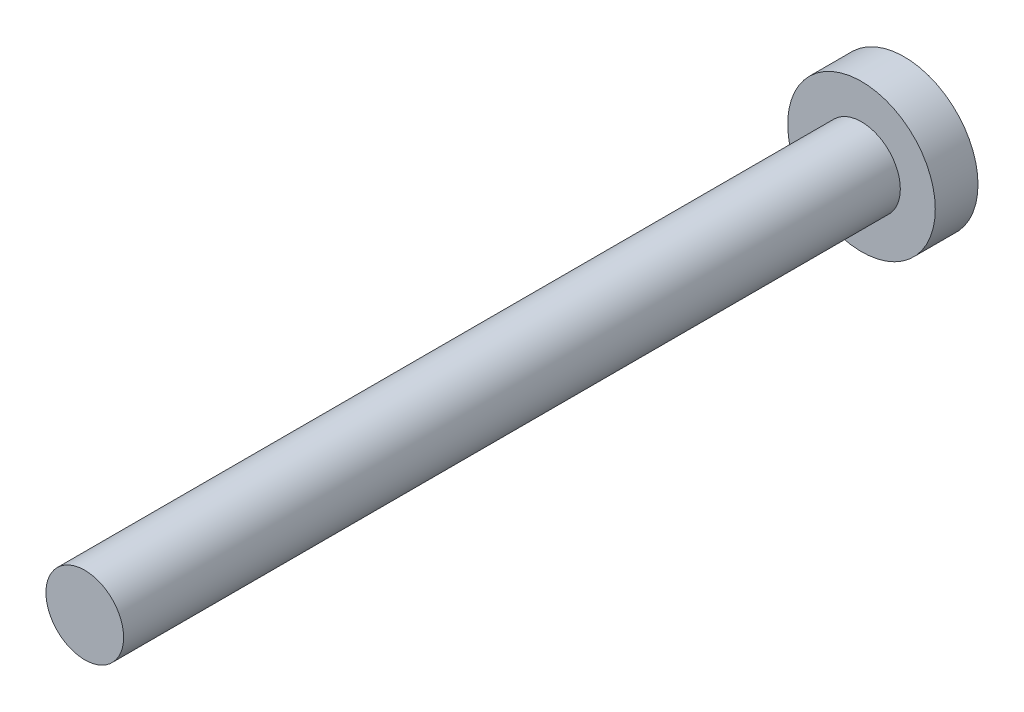
ISO-10303-21;
HEADER;
FILE_DESCRIPTION(('STEP AP214'),'2;1');
FILE_NAME('part.step','',(''),(''),'','','');
FILE_SCHEMA(('AUTOMOTIVE_DESIGN { 1 0 10303 214 1 1 1 1 }'));
ENDSEC;
DATA;
#1=APPLICATION_CONTEXT('core data for automotive mechanical design processes');
#2=APPLICATION_PROTOCOL_DEFINITION('international standard','automotive_design',2000,#1);
#3=PRODUCT_CONTEXT('',#1,'mechanical');
#4=PRODUCT('Part','Part','',(#3));
#5=PRODUCT_RELATED_PRODUCT_CATEGORY('part','',(#4));
#6=PRODUCT_DEFINITION_FORMATION('','',#4);
#7=PRODUCT_DEFINITION_CONTEXT('part definition',#1,'design');
#8=PRODUCT_DEFINITION('design','',#6,#7);
#9=PRODUCT_DEFINITION_SHAPE('','',#8);
#10=(LENGTH_UNIT() NAMED_UNIT(*) SI_UNIT(.MILLI.,.METRE.));
#11=(NAMED_UNIT(*) PLANE_ANGLE_UNIT() SI_UNIT($,.RADIAN.));
#12=(NAMED_UNIT(*) SI_UNIT($,.STERADIAN.) SOLID_ANGLE_UNIT());
#13=UNCERTAINTY_MEASURE_WITH_UNIT(LENGTH_MEASURE(1.E-05),#10,'distance_accuracy_value','');
#14=(GEOMETRIC_REPRESENTATION_CONTEXT(3) GLOBAL_UNCERTAINTY_ASSIGNED_CONTEXT((#13)) GLOBAL_UNIT_ASSIGNED_CONTEXT((#10,
#11,#12)) REPRESENTATION_CONTEXT('',''));
#15=CARTESIAN_POINT('',(0.,0.,0.));
#16=DIRECTION('',(0.,0.,1.));
#17=DIRECTION('',(1.,0.,0.));
#18=AXIS2_PLACEMENT_3D('',#15,#16,#17);
#19=CARTESIAN_POINT('',(0.,0.,0.));
#20=DIRECTION('',(0.,0.,-1.));
#21=DIRECTION('',(-1.,0.,0.));
#22=AXIS2_PLACEMENT_3D('',#19,#20,#21);
#23=CYLINDRICAL_SURFACE('',#22,3.8);
#24=CARTESIAN_POINT('',(0.,0.,0.));
#25=DIRECTION('',(0.,0.,1.));
#26=DIRECTION('',(1.,0.,0.));
#27=AXIS2_PLACEMENT_3D('',#24,#25,#26);
#28=CIRCLE('',#27,3.8);
#29=CARTESIAN_POINT('',(3.8,0.,0.));
#30=VERTEX_POINT('',#29);
#31=EDGE_CURVE('E51',#30,#30,#28,.T.);
#32=ORIENTED_EDGE('',*,*,#31,.F.);
#33=EDGE_LOOP('',(#32));
#34=FACE_BOUND('',#33,.T.);
#35=CARTESIAN_POINT('',(0.,0.,-2.2));
#36=DIRECTION('',(0.,0.,1.));
#37=DIRECTION('',(1.,0.,0.));
#38=AXIS2_PLACEMENT_3D('',#35,#36,#37);
#39=CIRCLE('',#38,3.8);
#40=CARTESIAN_POINT('',(3.8,0.,-2.2));
#41=VERTEX_POINT('',#40);
#42=EDGE_CURVE('E46',#41,#41,#39,.T.);
#43=ORIENTED_EDGE('',*,*,#42,.T.);
#44=EDGE_LOOP('',(#43));
#45=FACE_BOUND('',#44,.T.);
#46=ADVANCED_FACE('F43',(#34,#45),#23,.T.);
#47=CARTESIAN_POINT('',(0.,0.,0.));
#48=DIRECTION('',(0.,0.,1.));
#49=DIRECTION('',(1.,0.,0.));
#50=AXIS2_PLACEMENT_3D('',#47,#48,#49);
#51=PLANE('',#50);
#52=CARTESIAN_POINT('',(0.,0.,0.));
#53=DIRECTION('',(0.,0.,1.));
#54=DIRECTION('',(1.,0.,0.));
#55=AXIS2_PLACEMENT_3D('',#52,#53,#54);
#56=CIRCLE('',#55,2.);
#57=CARTESIAN_POINT('',(2.,0.,0.));
#58=VERTEX_POINT('',#57);
#59=EDGE_CURVE('E10',#58,#58,#56,.T.);
#60=ORIENTED_EDGE('',*,*,#59,.F.);
#61=EDGE_LOOP('',(#60));
#62=FACE_BOUND('',#61,.T.);
#63=ORIENTED_EDGE('',*,*,#31,.T.);
#64=EDGE_LOOP('',(#63));
#65=FACE_BOUND('',#64,.T.);
#66=ADVANCED_FACE('F71',(#62,#65),#51,.T.);
#67=CARTESIAN_POINT('',(0.,0.,-2.2));
#68=DIRECTION('',(0.,0.,1.));
#69=DIRECTION('',(1.,0.,0.));
#70=AXIS2_PLACEMENT_3D('',#67,#68,#69);
#71=PLANE('',#70);
#72=ORIENTED_EDGE('',*,*,#42,.F.);
#73=EDGE_LOOP('',(#72));
#74=FACE_BOUND('',#73,.T.);
#75=ADVANCED_FACE('F68',(#74),#71,.F.);
#76=CARTESIAN_POINT('',(0.,0.,40.));
#77=DIRECTION('',(0.,0.,-1.));
#78=DIRECTION('',(-1.,0.,0.));
#79=AXIS2_PLACEMENT_3D('',#76,#77,#78);
#80=CYLINDRICAL_SURFACE('',#79,2.);
#81=CARTESIAN_POINT('',(0.,0.,40.));
#82=DIRECTION('',(0.,0.,1.));
#83=DIRECTION('',(1.,0.,0.));
#84=AXIS2_PLACEMENT_3D('',#81,#82,#83);
#85=CIRCLE('',#84,2.);
#86=CARTESIAN_POINT('',(2.,0.,40.));
#87=VERTEX_POINT('',#86);
#88=EDGE_CURVE('E59',#87,#87,#85,.T.);
#89=ORIENTED_EDGE('',*,*,#88,.F.);
#90=EDGE_LOOP('',(#89));
#91=FACE_BOUND('',#90,.T.);
#92=ORIENTED_EDGE('',*,*,#59,.T.);
#93=EDGE_LOOP('',(#92));
#94=FACE_BOUND('',#93,.T.);
#95=ADVANCED_FACE('F70',(#91,#94),#80,.T.);
#96=CARTESIAN_POINT('',(0.,0.,40.));
#97=DIRECTION('',(0.,0.,1.));
#98=DIRECTION('',(1.,0.,0.));
#99=AXIS2_PLACEMENT_3D('',#96,#97,#98);
#100=PLANE('',#99);
#101=ORIENTED_EDGE('',*,*,#88,.T.);
#102=EDGE_LOOP('',(#101));
#103=FACE_BOUND('',#102,.T.);
#104=ADVANCED_FACE('F75',(#103),#100,.T.);
#105=CLOSED_SHELL('',(#46,#66,#75,#95,#104));
#106=MANIFOLD_SOLID_BREP('B2',#105);
#107=ADVANCED_BREP_SHAPE_REPRESENTATION('',(#18,#106),#14);
#108=SHAPE_DEFINITION_REPRESENTATION(#9,#107);
ENDSEC;
END-ISO-10303-21;
